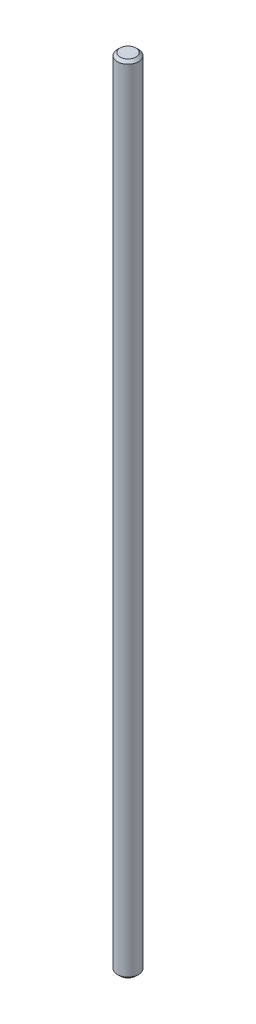
ISO-10303-21;
HEADER;
FILE_DESCRIPTION(('STEP AP214'),'2;1');
FILE_NAME('part.step','',(''),(''),'','','');
FILE_SCHEMA(('AUTOMOTIVE_DESIGN { 1 0 10303 214 1 1 1 1 }'));
ENDSEC;
DATA;
#1=APPLICATION_CONTEXT('core data for automotive mechanical design processes');
#2=APPLICATION_PROTOCOL_DEFINITION('international standard','automotive_design',2000,#1);
#3=PRODUCT_CONTEXT('',#1,'mechanical');
#4=PRODUCT('Part','Part','',(#3));
#5=PRODUCT_RELATED_PRODUCT_CATEGORY('part','',(#4));
#6=PRODUCT_DEFINITION_FORMATION('','',#4);
#7=PRODUCT_DEFINITION_CONTEXT('part definition',#1,'design');
#8=PRODUCT_DEFINITION('design','',#6,#7);
#9=PRODUCT_DEFINITION_SHAPE('','',#8);
#10=(LENGTH_UNIT() NAMED_UNIT(*) SI_UNIT(.MILLI.,.METRE.));
#11=(NAMED_UNIT(*) PLANE_ANGLE_UNIT() SI_UNIT($,.RADIAN.));
#12=(NAMED_UNIT(*) SI_UNIT($,.STERADIAN.) SOLID_ANGLE_UNIT());
#13=UNCERTAINTY_MEASURE_WITH_UNIT(LENGTH_MEASURE(1.E-05),#10,'distance_accuracy_value','');
#14=(GEOMETRIC_REPRESENTATION_CONTEXT(3) GLOBAL_UNCERTAINTY_ASSIGNED_CONTEXT((#13)) GLOBAL_UNIT_ASSIGNED_CONTEXT((#10,
#11,#12)) REPRESENTATION_CONTEXT('',''));
#15=CARTESIAN_POINT('',(0.,0.,0.));
#16=DIRECTION('',(0.,0.,1.));
#17=DIRECTION('',(1.,0.,0.));
#18=AXIS2_PLACEMENT_3D('',#15,#16,#17);
#19=CARTESIAN_POINT('',(0.,300.,0.));
#20=DIRECTION('',(0.,-1.,0.));
#21=DIRECTION('',(0.,0.,-1.));
#22=AXIS2_PLACEMENT_3D('',#19,#20,#21);
#23=CYLINDRICAL_SURFACE('',#22,4.);
#24=CARTESIAN_POINT('',(0.,299.,0.));
#25=DIRECTION('',(0.,1.,0.));
#26=DIRECTION('',(0.,0.,1.));
#27=AXIS2_PLACEMENT_3D('',#24,#25,#26);
#28=CIRCLE('',#27,4.);
#29=CARTESIAN_POINT('',(0.,299.,4.));
#30=VERTEX_POINT('',#29);
#31=EDGE_CURVE('E45',#30,#30,#28,.F.);
#32=ORIENTED_EDGE('',*,*,#31,.T.);
#33=EDGE_LOOP('',(#32));
#34=FACE_BOUND('',#33,.T.);
#35=CARTESIAN_POINT('',(0.,1.00000000000006,0.));
#36=DIRECTION('',(0.,1.,0.));
#37=DIRECTION('',(0.,0.,1.));
#38=AXIS2_PLACEMENT_3D('',#35,#36,#37);
#39=CIRCLE('',#38,4.);
#40=CARTESIAN_POINT('',(0.,1.00000000000006,4.));
#41=VERTEX_POINT('',#40);
#42=EDGE_CURVE('E49',#41,#41,#39,.T.);
#43=ORIENTED_EDGE('',*,*,#42,.T.);
#44=EDGE_LOOP('',(#43));
#45=FACE_BOUND('',#44,.T.);
#46=ADVANCED_FACE('F37',(#34,#45),#23,.T.);
#47=CARTESIAN_POINT('',(0.,300.,0.));
#48=DIRECTION('',(0.,1.,0.));
#49=DIRECTION('',(0.,0.,1.));
#50=AXIS2_PLACEMENT_3D('',#47,#48,#49);
#51=PLANE('',#50);
#52=CARTESIAN_POINT('',(0.,300.,0.));
#53=DIRECTION('',(0.,1.,0.));
#54=DIRECTION('',(0.,0.,1.));
#55=AXIS2_PLACEMENT_3D('',#52,#53,#54);
#56=CIRCLE('',#55,2.99999999999998);
#57=CARTESIAN_POINT('',(0.,300.,2.99999999999998));
#58=VERTEX_POINT('',#57);
#59=EDGE_CURVE('E53',#58,#58,#56,.T.);
#60=ORIENTED_EDGE('',*,*,#59,.T.);
#61=EDGE_LOOP('',(#60));
#62=FACE_BOUND('',#61,.T.);
#63=ADVANCED_FACE('F59',(#62),#51,.T.);
#64=CARTESIAN_POINT('',(0.,0.,0.));
#65=DIRECTION('',(0.,1.,0.));
#66=DIRECTION('',(0.,0.,1.));
#67=AXIS2_PLACEMENT_3D('',#64,#65,#66);
#68=PLANE('',#67);
#69=CARTESIAN_POINT('',(0.,0.,0.));
#70=DIRECTION('',(0.,1.,0.));
#71=DIRECTION('',(0.,0.,1.));
#72=AXIS2_PLACEMENT_3D('',#69,#70,#71);
#73=CIRCLE('',#72,2.99999999999992);
#74=CARTESIAN_POINT('',(0.,0.,2.99999999999992));
#75=VERTEX_POINT('',#74);
#76=EDGE_CURVE('E10',#75,#75,#73,.F.);
#77=ORIENTED_EDGE('',*,*,#76,.T.);
#78=EDGE_LOOP('',(#77));
#79=FACE_BOUND('',#78,.T.);
#80=ADVANCED_FACE('F63',(#79),#68,.F.);
#81=CARTESIAN_POINT('',(0.,300.,0.));
#82=DIRECTION('',(0.,-1.,0.));
#83=DIRECTION('',(0.,0.,-1.));
#84=AXIS2_PLACEMENT_3D('',#81,#82,#83);
#85=CONICAL_SURFACE('',#84,2.99999999999998,0.78539816339746);
#86=ORIENTED_EDGE('',*,*,#31,.F.);
#87=EDGE_LOOP('',(#86));
#88=FACE_BOUND('',#87,.T.);
#89=ORIENTED_EDGE('',*,*,#59,.F.);
#90=EDGE_LOOP('',(#89));
#91=FACE_BOUND('',#90,.T.);
#92=ADVANCED_FACE('F61',(#88,#91),#85,.T.);
#93=CARTESIAN_POINT('',(0.,1.00000000000006,0.));
#94=DIRECTION('',(0.,1.,0.));
#95=DIRECTION('',(0.,0.,1.));
#96=AXIS2_PLACEMENT_3D('',#93,#94,#95);
#97=CONICAL_SURFACE('',#96,4.,0.78539816339746);
#98=ORIENTED_EDGE('',*,*,#76,.F.);
#99=EDGE_LOOP('',(#98));
#100=FACE_BOUND('',#99,.T.);
#101=ORIENTED_EDGE('',*,*,#42,.F.);
#102=EDGE_LOOP('',(#101));
#103=FACE_BOUND('',#102,.T.);
#104=ADVANCED_FACE('F40',(#100,#103),#97,.T.);
#105=CLOSED_SHELL('',(#46,#63,#80,#92,#104));
#106=MANIFOLD_SOLID_BREP('B2',#105);
#107=ADVANCED_BREP_SHAPE_REPRESENTATION('',(#18,#106),#14);
#108=SHAPE_DEFINITION_REPRESENTATION(#9,#107);
ENDSEC;
END-ISO-10303-21;
